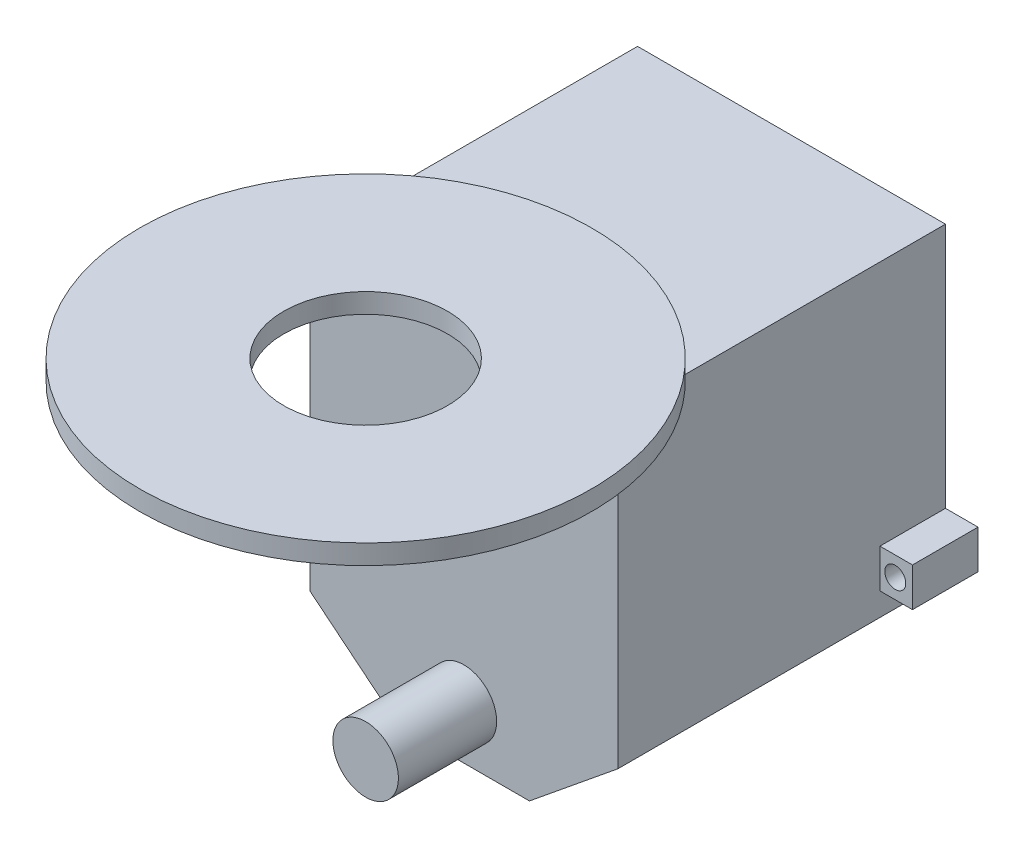
ISO-10303-21;
HEADER;
FILE_DESCRIPTION(('STEP AP214'),'2;1');
FILE_NAME('part.step','',(''),(''),'','','');
FILE_SCHEMA(('AUTOMOTIVE_DESIGN { 1 0 10303 214 1 1 1 1 }'));
ENDSEC;
DATA;
#1=APPLICATION_CONTEXT('core data for automotive mechanical design processes');
#2=APPLICATION_PROTOCOL_DEFINITION('international standard','automotive_design',2000,#1);
#3=PRODUCT_CONTEXT('',#1,'mechanical');
#4=PRODUCT('Part','Part','',(#3));
#5=PRODUCT_RELATED_PRODUCT_CATEGORY('part','',(#4));
#6=PRODUCT_DEFINITION_FORMATION('','',#4);
#7=PRODUCT_DEFINITION_CONTEXT('part definition',#1,'design');
#8=PRODUCT_DEFINITION('design','',#6,#7);
#9=PRODUCT_DEFINITION_SHAPE('','',#8);
#10=(LENGTH_UNIT() NAMED_UNIT(*) SI_UNIT(.MILLI.,.METRE.));
#11=(NAMED_UNIT(*) PLANE_ANGLE_UNIT() SI_UNIT($,.RADIAN.));
#12=(NAMED_UNIT(*) SI_UNIT($,.STERADIAN.) SOLID_ANGLE_UNIT());
#13=UNCERTAINTY_MEASURE_WITH_UNIT(LENGTH_MEASURE(1.E-05),#10,'distance_accuracy_value','');
#14=(GEOMETRIC_REPRESENTATION_CONTEXT(3) GLOBAL_UNCERTAINTY_ASSIGNED_CONTEXT((#13)) GLOBAL_UNIT_ASSIGNED_CONTEXT((#10,
#11,#12)) REPRESENTATION_CONTEXT('',''));
#15=CARTESIAN_POINT('',(0.,0.,0.));
#16=DIRECTION('',(0.,0.,1.));
#17=DIRECTION('',(1.,0.,0.));
#18=AXIS2_PLACEMENT_3D('',#15,#16,#17);
#19=CARTESIAN_POINT('',(-3.25491694199694,-4.5159884679955,10.));
#20=DIRECTION('',(0.,1.,0.));
#21=DIRECTION('',(-1.,0.,0.));
#22=AXIS2_PLACEMENT_3D('',#19,#20,#21);
#23=PLANE('',#22);
#24=DIRECTION('',(1.,0.,0.));
#25=VECTOR('',#24,1.);
#26=CARTESIAN_POINT('',(-3.25491694199694,-4.5159884679955,0.));
#27=LINE('',#26,#25);
#28=CARTESIAN_POINT('',(-3.25491694199694,-4.5159884679955,0.));
#29=VERTEX_POINT('',#28);
#30=CARTESIAN_POINT('',(1.41332373157611,-4.51598846799551,0.));
#31=VERTEX_POINT('',#30);
#32=EDGE_CURVE('E123',#29,#31,#27,.T.);
#33=ORIENTED_EDGE('',*,*,#32,.T.);
#34=DIRECTION('',(0.,0.,-1.));
#35=VECTOR('',#34,1.);
#36=CARTESIAN_POINT('',(1.41332373157611,-4.51598846799551,10.));
#37=LINE('',#36,#35);
#38=CARTESIAN_POINT('',(1.41332373157611,-4.51598846799551,10.));
#39=VERTEX_POINT('',#38);
#40=EDGE_CURVE('E13',#39,#31,#37,.T.);
#41=ORIENTED_EDGE('',*,*,#40,.F.);
#42=DIRECTION('',(1.,0.,0.));
#43=VECTOR('',#42,1.);
#44=CARTESIAN_POINT('',(-3.25491694199694,-4.5159884679955,10.));
#45=LINE('',#44,#43);
#46=CARTESIAN_POINT('',(-3.25491694199694,-4.5159884679955,10.));
#47=VERTEX_POINT('',#46);
#48=EDGE_CURVE('E111',#47,#39,#45,.T.);
#49=ORIENTED_EDGE('',*,*,#48,.F.);
#50=DIRECTION('',(0.,0.,-1.));
#51=VECTOR('',#50,1.);
#52=CARTESIAN_POINT('',(-3.25491694199694,-4.5159884679955,10.));
#53=LINE('',#52,#51);
#54=EDGE_CURVE('E119',#47,#29,#53,.T.);
#55=ORIENTED_EDGE('',*,*,#54,.T.);
#56=EDGE_LOOP('',(#33,#41,#49,#55));
#57=FACE_BOUND('',#56,.T.);
#58=ADVANCED_FACE('F60',(#57),#23,.F.);
#59=CARTESIAN_POINT('',(1.41332373157611,-4.51598846799551,10.));
#60=DIRECTION('',(-1.,0.,0.));
#61=DIRECTION('',(0.,0.,1.));
#62=AXIS2_PLACEMENT_3D('',#59,#60,#61);
#63=PLANE('',#62);
#64=DIRECTION('',(0.,1.,0.));
#65=VECTOR('',#64,1.);
#66=CARTESIAN_POINT('',(1.41332373157611,-4.51598846799551,0.));
#67=LINE('',#66,#65);
#68=CARTESIAN_POINT('',(1.41332373157611,0.,0.));
#69=VERTEX_POINT('',#68);
#70=EDGE_CURVE('E115',#31,#69,#67,.T.);
#71=ORIENTED_EDGE('',*,*,#70,.T.);
#72=DIRECTION('',(0.,0.,-1.));
#73=VECTOR('',#72,1.);
#74=CARTESIAN_POINT('',(1.41332373157611,0.,10.));
#75=LINE('',#74,#73);
#76=CARTESIAN_POINT('',(1.41332373157611,0.,10.));
#77=VERTEX_POINT('',#76);
#78=EDGE_CURVE('E68',#77,#69,#75,.T.);
#79=ORIENTED_EDGE('',*,*,#78,.F.);
#80=DIRECTION('',(0.,1.,0.));
#81=VECTOR('',#80,1.);
#82=CARTESIAN_POINT('',(1.41332373157611,-4.51598846799551,10.));
#83=LINE('',#82,#81);
#84=EDGE_CURVE('E106',#39,#77,#83,.T.);
#85=ORIENTED_EDGE('',*,*,#84,.F.);
#86=ORIENTED_EDGE('',*,*,#40,.T.);
#87=EDGE_LOOP('',(#71,#79,#85,#86));
#88=FACE_BOUND('',#87,.T.);
#89=ADVANCED_FACE('F114',(#88),#63,.F.);
#90=CARTESIAN_POINT('',(1.41332373157611,0.,10.));
#91=DIRECTION('',(0.,-1.,0.));
#92=DIRECTION('',(0.,0.,-1.));
#93=AXIS2_PLACEMENT_3D('',#90,#91,#92);
#94=PLANE('',#93);
#95=DIRECTION('',(-1.,0.,0.));
#96=VECTOR('',#95,1.);
#97=CARTESIAN_POINT('',(1.41332373157611,0.,0.));
#98=LINE('',#97,#96);
#99=CARTESIAN_POINT('',(-3.25491694199694,0.,0.));
#100=VERTEX_POINT('',#99);
#101=EDGE_CURVE('E93',#69,#100,#98,.T.);
#102=ORIENTED_EDGE('',*,*,#101,.T.);
#103=DIRECTION('',(0.,0.,-1.));
#104=VECTOR('',#103,1.);
#105=CARTESIAN_POINT('',(-3.25491694199694,0.,10.));
#106=LINE('',#105,#104);
#107=CARTESIAN_POINT('',(-3.25491694199694,0.,10.));
#108=VERTEX_POINT('',#107);
#109=EDGE_CURVE('E116',#108,#100,#106,.T.);
#110=ORIENTED_EDGE('',*,*,#109,.F.);
#111=DIRECTION('',(-1.,0.,0.));
#112=VECTOR('',#111,1.);
#113=CARTESIAN_POINT('',(1.41332373157611,0.,10.));
#114=LINE('',#113,#112);
#115=EDGE_CURVE('E109',#77,#108,#114,.T.);
#116=ORIENTED_EDGE('',*,*,#115,.F.);
#117=ORIENTED_EDGE('',*,*,#78,.T.);
#118=EDGE_LOOP('',(#102,#110,#116,#117));
#119=FACE_BOUND('',#118,.T.);
#120=ADVANCED_FACE('F117',(#119),#94,.F.);
#121=CARTESIAN_POINT('',(-3.25491694199694,0.,10.));
#122=DIRECTION('',(1.,0.,0.));
#123=DIRECTION('',(0.,1.,0.));
#124=AXIS2_PLACEMENT_3D('',#121,#122,#123);
#125=PLANE('',#124);
#126=DIRECTION('',(0.,-1.,0.));
#127=VECTOR('',#126,1.);
#128=CARTESIAN_POINT('',(-3.25491694199694,0.,0.));
#129=LINE('',#128,#127);
#130=EDGE_CURVE('E99',#100,#29,#129,.T.);
#131=ORIENTED_EDGE('',*,*,#130,.T.);
#132=ORIENTED_EDGE('',*,*,#54,.F.);
#133=DIRECTION('',(0.,-1.,0.));
#134=VECTOR('',#133,1.);
#135=CARTESIAN_POINT('',(-3.25491694199694,0.,10.));
#136=LINE('',#135,#134);
#137=EDGE_CURVE('E76',#108,#47,#136,.T.);
#138=ORIENTED_EDGE('',*,*,#137,.F.);
#139=ORIENTED_EDGE('',*,*,#109,.T.);
#140=EDGE_LOOP('',(#131,#132,#138,#139));
#141=FACE_BOUND('',#140,.T.);
#142=ADVANCED_FACE('F131',(#141),#125,.F.);
#143=CARTESIAN_POINT('',(0.,0.,10.));
#144=DIRECTION('',(0.,0.,1.));
#145=DIRECTION('',(1.,0.,0.));
#146=AXIS2_PLACEMENT_3D('',#143,#144,#145);
#147=PLANE('',#146);
#148=CARTESIAN_POINT('',(-1.16129211516998,-2.32651944105953,10.));
#149=DIRECTION('',(0.,0.,-1.));
#150=DIRECTION('',(-1.,0.,0.));
#151=AXIS2_PLACEMENT_3D('',#148,#149,#150);
#152=CIRCLE('',#151,1.6);
#153=CARTESIAN_POINT('',(-2.76129211516998,-2.32651944105953,10.));
#154=VERTEX_POINT('',#153);
#155=EDGE_CURVE('E126',#154,#154,#152,.T.);
#156=ORIENTED_EDGE('',*,*,#155,.T.);
#157=EDGE_LOOP('',(#156));
#158=FACE_BOUND('',#157,.T.);
#159=ORIENTED_EDGE('',*,*,#48,.T.);
#160=ORIENTED_EDGE('',*,*,#84,.T.);
#161=ORIENTED_EDGE('',*,*,#115,.T.);
#162=ORIENTED_EDGE('',*,*,#137,.T.);
#163=EDGE_LOOP('',(#159,#160,#161,#162));
#164=FACE_BOUND('',#163,.T.);
#165=ADVANCED_FACE('F107',(#158,#164),#147,.T.);
#166=CARTESIAN_POINT('',(0.,0.,0.));
#167=DIRECTION('',(0.,0.,1.));
#168=DIRECTION('',(1.,0.,0.));
#169=AXIS2_PLACEMENT_3D('',#166,#167,#168);
#170=PLANE('',#169);
#171=CARTESIAN_POINT('',(-1.16129211516998,-2.32651944105953,0.));
#172=DIRECTION('',(0.,0.,-1.));
#173=DIRECTION('',(-1.,0.,0.));
#174=AXIS2_PLACEMENT_3D('',#171,#172,#173);
#175=CIRCLE('',#174,1.6);
#176=CARTESIAN_POINT('',(-2.76129211516998,-2.32651944105953,0.));
#177=VERTEX_POINT('',#176);
#178=EDGE_CURVE('E137',#177,#177,#175,.T.);
#179=ORIENTED_EDGE('',*,*,#178,.F.);
#180=EDGE_LOOP('',(#179));
#181=FACE_BOUND('',#180,.T.);
#182=ORIENTED_EDGE('',*,*,#32,.F.);
#183=ORIENTED_EDGE('',*,*,#130,.F.);
#184=ORIENTED_EDGE('',*,*,#101,.F.);
#185=ORIENTED_EDGE('',*,*,#70,.F.);
#186=EDGE_LOOP('',(#182,#183,#184,#185));
#187=FACE_BOUND('',#186,.T.);
#188=ADVANCED_FACE('F134',(#181,#187),#170,.F.);
#189=CARTESIAN_POINT('',(-1.16129211516998,-2.32651944105953,10.));
#190=DIRECTION('',(0.,0.,-1.));
#191=DIRECTION('',(-1.,0.,0.));
#192=AXIS2_PLACEMENT_3D('',#189,#190,#191);
#193=CYLINDRICAL_SURFACE('',#192,1.6);
#194=ORIENTED_EDGE('',*,*,#155,.F.);
#195=EDGE_LOOP('',(#194));
#196=FACE_BOUND('',#195,.T.);
#197=ORIENTED_EDGE('',*,*,#178,.T.);
#198=EDGE_LOOP('',(#197));
#199=FACE_BOUND('',#198,.T.);
#200=ADVANCED_FACE('F144',(#196,#199),#193,.F.);
#201=CLOSED_SHELL('',(#58,#89,#120,#142,#165,#188,#200));
#202=MANIFOLD_SOLID_BREP('B2',#201);
#203=CARTESIAN_POINT('',(-23.5,11.,50.));
#204=DIRECTION('',(1.,0.,0.));
#205=DIRECTION('',(0.,0.,-1.));
#206=AXIS2_PLACEMENT_3D('',#203,#204,#205);
#207=PLANE('',#206);
#208=DIRECTION('',(0.,0.,-1.));
#209=VECTOR('',#208,1.);
#210=CARTESIAN_POINT('',(-23.5,20.4345973168426,10.));
#211=LINE('',#210,#209);
#212=CARTESIAN_POINT('',(-23.5,20.4345973168426,10.));
#213=VERTEX_POINT('',#212);
#214=CARTESIAN_POINT('',(-23.5,20.4345973168426,0.));
#215=VERTEX_POINT('',#214);
#216=EDGE_CURVE('E408',#213,#215,#211,.T.);
#217=ORIENTED_EDGE('',*,*,#216,.F.);
#218=DIRECTION('',(0.,1.,0.));
#219=VECTOR('',#218,1.);
#220=CARTESIAN_POINT('',(-23.5,14.5178015456926,10.));
#221=LINE('',#220,#219);
#222=CARTESIAN_POINT('',(-23.5,14.5178015456926,10.));
#223=VERTEX_POINT('',#222);
#224=EDGE_CURVE('E393',#223,#213,#221,.T.);
#225=ORIENTED_EDGE('',*,*,#224,.F.);
#226=DIRECTION('',(0.,0.,-1.));
#227=VECTOR('',#226,1.);
#228=CARTESIAN_POINT('',(-23.5,14.5178015456926,10.));
#229=LINE('',#228,#227);
#230=CARTESIAN_POINT('',(-23.5,14.5178015456926,0.));
#231=VERTEX_POINT('',#230);
#232=EDGE_CURVE('E403',#223,#231,#229,.T.);
#233=ORIENTED_EDGE('',*,*,#232,.T.);
#234=DIRECTION('',(0.,-1.,0.));
#235=VECTOR('',#234,1.);
#236=CARTESIAN_POINT('',(-23.5,11.,0.));
#237=LINE('',#236,#235);
#238=CARTESIAN_POINT('',(-23.5,11.,0.));
#239=VERTEX_POINT('',#238);
#240=EDGE_CURVE('E520',#231,#239,#237,.T.);
#241=ORIENTED_EDGE('',*,*,#240,.T.);
#242=DIRECTION('',(0.,0.,-1.));
#243=VECTOR('',#242,1.);
#244=CARTESIAN_POINT('',(-23.5,11.,50.));
#245=LINE('',#244,#243);
#246=CARTESIAN_POINT('',(-23.5,11.,50.));
#247=VERTEX_POINT('',#246);
#248=EDGE_CURVE('E368',#247,#239,#245,.T.);
#249=ORIENTED_EDGE('',*,*,#248,.F.);
#250=DIRECTION('',(0.,-1.,0.));
#251=VECTOR('',#250,1.);
#252=CARTESIAN_POINT('',(-23.5,11.,50.));
#253=LINE('',#252,#251);
#254=CARTESIAN_POINT('',(-23.5,58.,50.));
#255=VERTEX_POINT('',#254);
#256=EDGE_CURVE('E358',#255,#247,#253,.T.);
#257=ORIENTED_EDGE('',*,*,#256,.F.);
#258=DIRECTION('',(0.,0.,-1.));
#259=VECTOR('',#258,1.);
#260=CARTESIAN_POINT('',(-23.5,58.,50.));
#261=LINE('',#260,#259);
#262=CARTESIAN_POINT('',(-23.5,58.,39.7413381193698));
#263=VERTEX_POINT('',#262);
#264=EDGE_CURVE('E352',#255,#263,#261,.T.);
#265=ORIENTED_EDGE('',*,*,#264,.T.);
#266=CARTESIAN_POINT('',(-23.5,58.,0.));
#267=VERTEX_POINT('',#266);
#268=EDGE_CURVE('E355',#263,#267,#261,.T.);
#269=ORIENTED_EDGE('',*,*,#268,.T.);
#270=EDGE_CURVE('E500',#267,#215,#237,.T.);
#271=ORIENTED_EDGE('',*,*,#270,.T.);
#272=EDGE_LOOP('',(#217,#225,#233,#241,#249,#257,#265,#269,#271));
#273=FACE_BOUND('',#272,.T.);
#274=ADVANCED_FACE('F206',(#273),#207,.F.);
#275=CARTESIAN_POINT('',(23.5,11.,50.));
#276=DIRECTION('',(-1.,0.,0.));
#277=DIRECTION('',(0.,-1.,0.));
#278=AXIS2_PLACEMENT_3D('',#275,#276,#277);
#279=PLANE('',#278);
#280=DIRECTION('',(0.,0.,-1.));
#281=VECTOR('',#280,1.);
#282=CARTESIAN_POINT('',(23.5,14.5178015456926,10.));
#283=LINE('',#282,#281);
#284=CARTESIAN_POINT('',(23.5,14.5178015456926,10.));
#285=VERTEX_POINT('',#284);
#286=CARTESIAN_POINT('',(23.5,14.5178015456926,0.));
#287=VERTEX_POINT('',#286);
#288=EDGE_CURVE('E445',#285,#287,#283,.T.);
#289=ORIENTED_EDGE('',*,*,#288,.F.);
#290=DIRECTION('',(0.,1.,0.));
#291=VECTOR('',#290,1.);
#292=CARTESIAN_POINT('',(23.5,14.5178015456926,10.));
#293=LINE('',#292,#291);
#294=CARTESIAN_POINT('',(23.5,20.4345973168426,10.));
#295=VERTEX_POINT('',#294);
#296=EDGE_CURVE('E424',#285,#295,#293,.T.);
#297=ORIENTED_EDGE('',*,*,#296,.T.);
#298=DIRECTION('',(0.,0.,-1.));
#299=VECTOR('',#298,1.);
#300=CARTESIAN_POINT('',(23.5,20.4345973168426,10.));
#301=LINE('',#300,#299);
#302=CARTESIAN_POINT('',(23.5,20.4345973168426,0.));
#303=VERTEX_POINT('',#302);
#304=EDGE_CURVE('E437',#295,#303,#301,.T.);
#305=ORIENTED_EDGE('',*,*,#304,.T.);
#306=DIRECTION('',(0.,1.,0.));
#307=VECTOR('',#306,1.);
#308=CARTESIAN_POINT('',(23.5,11.,0.));
#309=LINE('',#308,#307);
#310=CARTESIAN_POINT('',(23.5,58.,0.));
#311=VERTEX_POINT('',#310);
#312=EDGE_CURVE('E515',#303,#311,#309,.T.);
#313=ORIENTED_EDGE('',*,*,#312,.T.);
#314=DIRECTION('',(0.,0.,-1.));
#315=VECTOR('',#314,1.);
#316=CARTESIAN_POINT('',(23.5,58.,50.));
#317=LINE('',#316,#315);
#318=CARTESIAN_POINT('',(23.5,58.,39.7413381193698));
#319=VERTEX_POINT('',#318);
#320=EDGE_CURVE('E362',#319,#311,#317,.T.);
#321=ORIENTED_EDGE('',*,*,#320,.F.);
#322=CARTESIAN_POINT('',(23.5,58.,50.));
#323=VERTEX_POINT('',#322);
#324=EDGE_CURVE('E374',#323,#319,#317,.T.);
#325=ORIENTED_EDGE('',*,*,#324,.F.);
#326=DIRECTION('',(0.,1.,0.));
#327=VECTOR('',#326,1.);
#328=CARTESIAN_POINT('',(23.5,11.,50.));
#329=LINE('',#328,#327);
#330=CARTESIAN_POINT('',(23.5,11.,50.));
#331=VERTEX_POINT('',#330);
#332=EDGE_CURVE('E504',#331,#323,#329,.T.);
#333=ORIENTED_EDGE('',*,*,#332,.F.);
#334=DIRECTION('',(0.,0.,-1.));
#335=VECTOR('',#334,1.);
#336=CARTESIAN_POINT('',(23.5,11.,50.));
#337=LINE('',#336,#335);
#338=CARTESIAN_POINT('',(23.5,11.,0.));
#339=VERTEX_POINT('',#338);
#340=EDGE_CURVE('E525',#331,#339,#337,.T.);
#341=ORIENTED_EDGE('',*,*,#340,.T.);
#342=EDGE_CURVE('E516',#339,#287,#309,.T.);
#343=ORIENTED_EDGE('',*,*,#342,.T.);
#344=EDGE_LOOP('',(#289,#297,#305,#313,#321,#325,#333,#341,#343));
#345=FACE_BOUND('',#344,.T.);
#346=ADVANCED_FACE('F551',(#345),#279,.F.);
#347=CARTESIAN_POINT('',(-9.99999999999999,0.,50.));
#348=DIRECTION('',(0.631672951162236,0.77523498551729,0.));
#349=DIRECTION('',(-0.775234985517289,0.631672951162235,0.));
#350=AXIS2_PLACEMENT_3D('',#347,#348,#349);
#351=PLANE('',#350);
#352=DIRECTION('',(0.77523498551729,-0.631672951162236,0.));
#353=VECTOR('',#352,1.);
#354=CARTESIAN_POINT('',(-9.99999999999999,0.,0.));
#355=LINE('',#354,#353);
#356=CARTESIAN_POINT('',(-9.99999999999999,0.,0.));
#357=VERTEX_POINT('',#356);
#358=EDGE_CURVE('E495',#239,#357,#355,.T.);
#359=ORIENTED_EDGE('',*,*,#358,.T.);
#360=DIRECTION('',(0.,0.,-1.));
#361=VECTOR('',#360,1.);
#362=CARTESIAN_POINT('',(-9.99999999999999,0.,50.));
#363=LINE('',#362,#361);
#364=CARTESIAN_POINT('',(-9.99999999999999,0.,50.));
#365=VERTEX_POINT('',#364);
#366=EDGE_CURVE('E214',#365,#357,#363,.T.);
#367=ORIENTED_EDGE('',*,*,#366,.F.);
#368=DIRECTION('',(0.77523498551729,-0.631672951162236,0.));
#369=VECTOR('',#368,1.);
#370=CARTESIAN_POINT('',(-9.99999999999999,0.,50.));
#371=LINE('',#370,#369);
#372=EDGE_CURVE('E496',#247,#365,#371,.T.);
#373=ORIENTED_EDGE('',*,*,#372,.F.);
#374=ORIENTED_EDGE('',*,*,#248,.T.);
#375=EDGE_LOOP('',(#359,#367,#373,#374));
#376=FACE_BOUND('',#375,.T.);
#377=ADVANCED_FACE('F208',(#376),#351,.F.);
#378=CARTESIAN_POINT('',(10.,0.,50.));
#379=DIRECTION('',(0.,1.,0.));
#380=DIRECTION('',(-1.,0.,0.));
#381=AXIS2_PLACEMENT_3D('',#378,#379,#380);
#382=PLANE('',#381);
#383=DIRECTION('',(1.,0.,0.));
#384=VECTOR('',#383,1.);
#385=CARTESIAN_POINT('',(10.,0.,0.));
#386=LINE('',#385,#384);
#387=CARTESIAN_POINT('',(10.,0.,0.));
#388=VERTEX_POINT('',#387);
#389=EDGE_CURVE('E511',#357,#388,#386,.T.);
#390=ORIENTED_EDGE('',*,*,#389,.T.);
#391=DIRECTION('',(0.,0.,-1.));
#392=VECTOR('',#391,1.);
#393=CARTESIAN_POINT('',(10.,0.,50.));
#394=LINE('',#393,#392);
#395=CARTESIAN_POINT('',(10.,0.,50.));
#396=VERTEX_POINT('',#395);
#397=EDGE_CURVE('E528',#396,#388,#394,.T.);
#398=ORIENTED_EDGE('',*,*,#397,.F.);
#399=DIRECTION('',(1.,0.,0.));
#400=VECTOR('',#399,1.);
#401=CARTESIAN_POINT('',(10.,0.,50.));
#402=LINE('',#401,#400);
#403=EDGE_CURVE('E499',#365,#396,#402,.T.);
#404=ORIENTED_EDGE('',*,*,#403,.F.);
#405=ORIENTED_EDGE('',*,*,#366,.T.);
#406=EDGE_LOOP('',(#390,#398,#404,#405));
#407=FACE_BOUND('',#406,.T.);
#408=ADVANCED_FACE('F533',(#407),#382,.F.);
#409=CARTESIAN_POINT('',(10.,0.,50.));
#410=DIRECTION('',(-0.631672951162236,0.775234985517289,0.));
#411=DIRECTION('',(-0.775234985517289,-0.631672951162236,0.));
#412=AXIS2_PLACEMENT_3D('',#409,#410,#411);
#413=PLANE('',#412);
#414=DIRECTION('',(0.775234985517289,0.631672951162236,0.));
#415=VECTOR('',#414,1.);
#416=CARTESIAN_POINT('',(10.,0.,0.));
#417=LINE('',#416,#415);
#418=EDGE_CURVE('E513',#388,#339,#417,.T.);
#419=ORIENTED_EDGE('',*,*,#418,.T.);
#420=ORIENTED_EDGE('',*,*,#340,.F.);
#421=DIRECTION('',(0.775234985517289,0.631672951162236,0.));
#422=VECTOR('',#421,1.);
#423=CARTESIAN_POINT('',(10.,0.,50.));
#424=LINE('',#423,#422);
#425=EDGE_CURVE('E502',#396,#331,#424,.T.);
#426=ORIENTED_EDGE('',*,*,#425,.F.);
#427=ORIENTED_EDGE('',*,*,#397,.T.);
#428=EDGE_LOOP('',(#419,#420,#426,#427));
#429=FACE_BOUND('',#428,.T.);
#430=ADVANCED_FACE('F546',(#429),#413,.F.);
#431=CARTESIAN_POINT('',(-23.5,58.,50.));
#432=DIRECTION('',(0.,-1.,0.));
#433=DIRECTION('',(1.,0.,0.));
#434=AXIS2_PLACEMENT_3D('',#431,#432,#433);
#435=PLANE('',#434);
#436=CARTESIAN_POINT('',(0.,58.,65.));
#437=DIRECTION('',(0.,1.,0.));
#438=DIRECTION('',(-1.,0.,0.));
#439=AXIS2_PLACEMENT_3D('',#436,#437,#438);
#440=CIRCLE('',#439,34.5);
#441=EDGE_CURVE('E221',#319,#263,#440,.T.);
#442=ORIENTED_EDGE('',*,*,#441,.F.);
#443=ORIENTED_EDGE('',*,*,#320,.T.);
#444=DIRECTION('',(-1.,0.,0.));
#445=VECTOR('',#444,1.);
#446=CARTESIAN_POINT('',(-23.5,58.,0.));
#447=LINE('',#446,#445);
#448=EDGE_CURVE('E366',#311,#267,#447,.T.);
#449=ORIENTED_EDGE('',*,*,#448,.T.);
#450=ORIENTED_EDGE('',*,*,#268,.F.);
#451=EDGE_LOOP('',(#442,#443,#449,#450));
#452=FACE_BOUND('',#451,.T.);
#453=ADVANCED_FACE('F364',(#452),#435,.F.);
#454=CARTESIAN_POINT('',(0.,0.,50.));
#455=DIRECTION('',(0.,0.,-1.));
#456=DIRECTION('',(-1.,0.,0.));
#457=AXIS2_PLACEMENT_3D('',#454,#455,#456);
#458=PLANE('',#457);
#459=CARTESIAN_POINT('',(0.,8.,50.));
#460=DIRECTION('',(0.,0.,-1.));
#461=DIRECTION('',(-1.,0.,0.));
#462=AXIS2_PLACEMENT_3D('',#459,#460,#461);
#463=CIRCLE('',#462,5.);
#464=CARTESIAN_POINT('',(-5.,8.,50.));
#465=VERTEX_POINT('',#464);
#466=EDGE_CURVE('E58',#465,#465,#463,.F.);
#467=ORIENTED_EDGE('',*,*,#466,.F.);
#468=EDGE_LOOP('',(#467));
#469=FACE_BOUND('',#468,.T.);
#470=ORIENTED_EDGE('',*,*,#372,.T.);
#471=ORIENTED_EDGE('',*,*,#403,.T.);
#472=ORIENTED_EDGE('',*,*,#425,.T.);
#473=ORIENTED_EDGE('',*,*,#332,.T.);
#474=DIRECTION('',(-1.,0.,0.));
#475=VECTOR('',#474,1.);
#476=CARTESIAN_POINT('',(-23.5,58.,50.));
#477=LINE('',#476,#475);
#478=EDGE_CURVE('E506',#323,#255,#477,.T.);
#479=ORIENTED_EDGE('',*,*,#478,.T.);
#480=ORIENTED_EDGE('',*,*,#256,.T.);
#481=EDGE_LOOP('',(#470,#471,#472,#473,#479,#480));
#482=FACE_BOUND('',#481,.T.);
#483=ADVANCED_FACE('F553',(#469,#482),#458,.F.);
#484=CARTESIAN_POINT('',(0.,0.,0.));
#485=DIRECTION('',(0.,0.,-1.));
#486=DIRECTION('',(-1.,0.,0.));
#487=AXIS2_PLACEMENT_3D('',#484,#485,#486);
#488=PLANE('',#487);
#489=DIRECTION('',(-1.,0.,0.));
#490=VECTOR('',#489,1.);
#491=CARTESIAN_POINT('',(9.28835004231492,2.,0.));
#492=LINE('',#491,#490);
#493=CARTESIAN_POINT('',(9.28835004231492,2.,0.));
#494=VERTEX_POINT('',#493);
#495=CARTESIAN_POINT('',(-9.2883500423149,2.,0.));
#496=VERTEX_POINT('',#495);
#497=EDGE_CURVE('E447',#494,#496,#492,.T.);
#498=ORIENTED_EDGE('',*,*,#497,.F.);
#499=DIRECTION('',(-0.775234985517289,-0.631672951162236,0.));
#500=VECTOR('',#499,1.);
#501=CARTESIAN_POINT('',(21.5,11.9502332988545,0.));
#502=LINE('',#501,#500);
#503=CARTESIAN_POINT('',(21.5,11.9502332988545,0.));
#504=VERTEX_POINT('',#503);
#505=EDGE_CURVE('E479',#504,#494,#502,.T.);
#506=ORIENTED_EDGE('',*,*,#505,.F.);
#507=DIRECTION('',(0.,-1.,0.));
#508=VECTOR('',#507,1.);
#509=CARTESIAN_POINT('',(21.5,56.,0.));
#510=LINE('',#509,#508);
#511=CARTESIAN_POINT('',(21.5,56.,0.));
#512=VERTEX_POINT('',#511);
#513=EDGE_CURVE('E476',#512,#504,#510,.T.);
#514=ORIENTED_EDGE('',*,*,#513,.F.);
#515=DIRECTION('',(1.,0.,0.));
#516=VECTOR('',#515,1.);
#517=CARTESIAN_POINT('',(-21.5,56.,0.));
#518=LINE('',#517,#516);
#519=CARTESIAN_POINT('',(-21.5,56.,0.));
#520=VERTEX_POINT('',#519);
#521=EDGE_CURVE('E473',#520,#512,#518,.T.);
#522=ORIENTED_EDGE('',*,*,#521,.F.);
#523=DIRECTION('',(0.,1.,0.));
#524=VECTOR('',#523,1.);
#525=CARTESIAN_POINT('',(-21.5,11.9502332988545,0.));
#526=LINE('',#525,#524);
#527=CARTESIAN_POINT('',(-21.5,11.9502332988545,0.));
#528=VERTEX_POINT('',#527);
#529=EDGE_CURVE('E470',#528,#520,#526,.T.);
#530=ORIENTED_EDGE('',*,*,#529,.F.);
#531=DIRECTION('',(-0.77523498551729,0.631672951162236,0.));
#532=VECTOR('',#531,1.);
#533=CARTESIAN_POINT('',(-9.2883500423149,2.,0.));
#534=LINE('',#533,#532);
#535=EDGE_CURVE('E467',#496,#528,#534,.T.);
#536=ORIENTED_EDGE('',*,*,#535,.F.);
#537=EDGE_LOOP('',(#498,#506,#514,#522,#530,#536));
#538=FACE_BOUND('',#537,.T.);
#539=ORIENTED_EDGE('',*,*,#358,.F.);
#540=ORIENTED_EDGE('',*,*,#240,.F.);
#541=DIRECTION('',(1.,0.,0.));
#542=VECTOR('',#541,1.);
#543=CARTESIAN_POINT('',(-28.4663618767547,14.5178015456926,0.));
#544=LINE('',#543,#542);
#545=CARTESIAN_POINT('',(-28.4663618767547,14.5178015456926,0.));
#546=VERTEX_POINT('',#545);
#547=EDGE_CURVE('E229',#546,#231,#544,.T.);
#548=ORIENTED_EDGE('',*,*,#547,.F.);
#549=DIRECTION('',(0.,-1.,0.));
#550=VECTOR('',#549,1.);
#551=CARTESIAN_POINT('',(-28.4663618767547,20.4345973168426,0.));
#552=LINE('',#551,#550);
#553=CARTESIAN_POINT('',(-28.4663618767547,20.4345973168426,0.));
#554=VERTEX_POINT('',#553);
#555=EDGE_CURVE('E405',#554,#546,#552,.T.);
#556=ORIENTED_EDGE('',*,*,#555,.F.);
#557=DIRECTION('',(-1.,0.,0.));
#558=VECTOR('',#557,1.);
#559=CARTESIAN_POINT('',(-23.5,20.4345973168426,0.));
#560=LINE('',#559,#558);
#561=EDGE_CURVE('E397',#215,#554,#560,.T.);
#562=ORIENTED_EDGE('',*,*,#561,.F.);
#563=ORIENTED_EDGE('',*,*,#270,.F.);
#564=ORIENTED_EDGE('',*,*,#448,.F.);
#565=ORIENTED_EDGE('',*,*,#312,.F.);
#566=DIRECTION('',(1.,0.,0.));
#567=VECTOR('',#566,1.);
#568=CARTESIAN_POINT('',(23.5,20.4345973168426,0.));
#569=LINE('',#568,#567);
#570=CARTESIAN_POINT('',(28.4663618767547,20.4345973168426,0.));
#571=VERTEX_POINT('',#570);
#572=EDGE_CURVE('E421',#303,#571,#569,.T.);
#573=ORIENTED_EDGE('',*,*,#572,.T.);
#574=DIRECTION('',(0.,-1.,0.));
#575=VECTOR('',#574,1.);
#576=CARTESIAN_POINT('',(28.4663618767547,20.4345973168426,0.));
#577=LINE('',#576,#575);
#578=CARTESIAN_POINT('',(28.4663618767547,14.5178015456926,0.));
#579=VERTEX_POINT('',#578);
#580=EDGE_CURVE('E440',#571,#579,#577,.T.);
#581=ORIENTED_EDGE('',*,*,#580,.T.);
#582=DIRECTION('',(-1.,0.,0.));
#583=VECTOR('',#582,1.);
#584=CARTESIAN_POINT('',(28.4663618767547,14.5178015456926,0.));
#585=LINE('',#584,#583);
#586=EDGE_CURVE('E428',#579,#287,#585,.T.);
#587=ORIENTED_EDGE('',*,*,#586,.T.);
#588=ORIENTED_EDGE('',*,*,#342,.F.);
#589=ORIENTED_EDGE('',*,*,#418,.F.);
#590=ORIENTED_EDGE('',*,*,#389,.F.);
#591=EDGE_LOOP('',(#539,#540,#548,#556,#562,#563,#564,#565,#573,#581,#587,#588,#589,#590));
#592=FACE_BOUND('',#591,.T.);
#593=CARTESIAN_POINT('',(25.8366748673547,17.4761994312676,0.));
#594=DIRECTION('',(0.,0.,-1.));
#595=DIRECTION('',(-1.,0.,0.));
#596=AXIS2_PLACEMENT_3D('',#593,#594,#595);
#597=CIRCLE('',#596,1.6);
#598=CARTESIAN_POINT('',(24.2366748673547,17.4761994312676,0.));
#599=VERTEX_POINT('',#598);
#600=EDGE_CURVE('E411',#599,#599,#597,.T.);
#601=ORIENTED_EDGE('',*,*,#600,.F.);
#602=EDGE_LOOP('',(#601));
#603=FACE_BOUND('',#602,.T.);
#604=CARTESIAN_POINT('',(-25.8366748673547,17.4761994312676,0.));
#605=DIRECTION('',(0.,0.,1.));
#606=DIRECTION('',(1.,0.,0.));
#607=AXIS2_PLACEMENT_3D('',#604,#605,#606);
#608=CIRCLE('',#607,1.6);
#609=CARTESIAN_POINT('',(-24.2366748673547,17.4761994312676,0.));
#610=VERTEX_POINT('',#609);
#611=EDGE_CURVE('E387',#610,#610,#608,.T.);
#612=ORIENTED_EDGE('',*,*,#611,.T.);
#613=EDGE_LOOP('',(#612));
#614=FACE_BOUND('',#613,.T.);
#615=ADVANCED_FACE('F540',(#538,#592,#603,#614),#488,.T.);
#616=CARTESIAN_POINT('',(9.28835004231492,2.,119.028979421689));
#617=DIRECTION('',(0.,-1.,0.));
#618=DIRECTION('',(1.,0.,0.));
#619=AXIS2_PLACEMENT_3D('',#616,#617,#618);
#620=PLANE('',#619);
#621=DIRECTION('',(1.,0.,0.));
#622=VECTOR('',#621,1.);
#623=CARTESIAN_POINT('',(9.28835004231492,2.,48.));
#624=LINE('',#623,#622);
#625=CARTESIAN_POINT('',(-9.2883500423149,2.,48.));
#626=VERTEX_POINT('',#625);
#627=CARTESIAN_POINT('',(9.28835004231492,2.,48.));
#628=VERTEX_POINT('',#627);
#629=EDGE_CURVE('E463',#626,#628,#624,.T.);
#630=ORIENTED_EDGE('',*,*,#629,.T.);
#631=DIRECTION('',(0.,0.,-1.));
#632=VECTOR('',#631,1.);
#633=CARTESIAN_POINT('',(9.28835004231492,2.,119.028979421689));
#634=LINE('',#633,#632);
#635=EDGE_CURVE('E457',#628,#494,#634,.T.);
#636=ORIENTED_EDGE('',*,*,#635,.T.);
#637=ORIENTED_EDGE('',*,*,#497,.T.);
#638=DIRECTION('',(0.,0.,-1.));
#639=VECTOR('',#638,1.);
#640=CARTESIAN_POINT('',(-9.2883500423149,2.,119.028979421689));
#641=LINE('',#640,#639);
#642=EDGE_CURVE('E482',#626,#496,#641,.T.);
#643=ORIENTED_EDGE('',*,*,#642,.F.);
#644=EDGE_LOOP('',(#630,#636,#637,#643));
#645=FACE_BOUND('',#644,.T.);
#646=ADVANCED_FACE('F613',(#645),#620,.F.);
#647=CARTESIAN_POINT('',(21.5,11.9502332988545,119.028979421689));
#648=DIRECTION('',(0.631672951162236,-0.775234985517289,0.));
#649=DIRECTION('',(0.775234985517289,0.631672951162236,0.));
#650=AXIS2_PLACEMENT_3D('',#647,#648,#649);
#651=PLANE('',#650);
#652=DIRECTION('',(0.775234985517289,0.631672951162236,0.));
#653=VECTOR('',#652,1.);
#654=CARTESIAN_POINT('',(21.5,11.9502332988545,48.));
#655=LINE('',#654,#653);
#656=CARTESIAN_POINT('',(21.5,11.9502332988545,48.));
#657=VERTEX_POINT('',#656);
#658=EDGE_CURVE('E461',#628,#657,#655,.T.);
#659=ORIENTED_EDGE('',*,*,#658,.T.);
#660=DIRECTION('',(0.,0.,-1.));
#661=VECTOR('',#660,1.);
#662=CARTESIAN_POINT('',(21.5,11.9502332988545,119.028979421689));
#663=LINE('',#662,#661);
#664=EDGE_CURVE('E484',#657,#504,#663,.T.);
#665=ORIENTED_EDGE('',*,*,#664,.T.);
#666=ORIENTED_EDGE('',*,*,#505,.T.);
#667=ORIENTED_EDGE('',*,*,#635,.F.);
#668=EDGE_LOOP('',(#659,#665,#666,#667));
#669=FACE_BOUND('',#668,.T.);
#670=ADVANCED_FACE('F618',(#669),#651,.F.);
#671=CARTESIAN_POINT('',(21.5,56.,119.028979421689));
#672=DIRECTION('',(1.,0.,0.));
#673=DIRECTION('',(0.,1.,0.));
#674=AXIS2_PLACEMENT_3D('',#671,#672,#673);
#675=PLANE('',#674);
#676=DIRECTION('',(0.,1.,0.));
#677=VECTOR('',#676,1.);
#678=CARTESIAN_POINT('',(21.5,56.,48.));
#679=LINE('',#678,#677);
#680=CARTESIAN_POINT('',(21.5,56.,48.));
#681=VERTEX_POINT('',#680);
#682=EDGE_CURVE('E459',#657,#681,#679,.T.);
#683=ORIENTED_EDGE('',*,*,#682,.T.);
#684=DIRECTION('',(0.,0.,-1.));
#685=VECTOR('',#684,1.);
#686=CARTESIAN_POINT('',(21.5,56.,119.028979421689));
#687=LINE('',#686,#685);
#688=EDGE_CURVE('E486',#681,#512,#687,.T.);
#689=ORIENTED_EDGE('',*,*,#688,.T.);
#690=ORIENTED_EDGE('',*,*,#513,.T.);
#691=ORIENTED_EDGE('',*,*,#664,.F.);
#692=EDGE_LOOP('',(#683,#689,#690,#691));
#693=FACE_BOUND('',#692,.T.);
#694=ADVANCED_FACE('F630',(#693),#675,.F.);
#695=CARTESIAN_POINT('',(-21.5,56.,119.028979421689));
#696=DIRECTION('',(0.,1.,0.));
#697=DIRECTION('',(-1.,0.,0.));
#698=AXIS2_PLACEMENT_3D('',#695,#696,#697);
#699=PLANE('',#698);
#700=DIRECTION('',(-1.,0.,0.));
#701=VECTOR('',#700,1.);
#702=CARTESIAN_POINT('',(-21.5,56.,48.));
#703=LINE('',#702,#701);
#704=CARTESIAN_POINT('',(-21.5,56.,48.));
#705=VERTEX_POINT('',#704);
#706=EDGE_CURVE('E456',#681,#705,#703,.T.);
#707=ORIENTED_EDGE('',*,*,#706,.T.);
#708=DIRECTION('',(0.,0.,-1.));
#709=VECTOR('',#708,1.);
#710=CARTESIAN_POINT('',(-21.5,56.,119.028979421689));
#711=LINE('',#710,#709);
#712=EDGE_CURVE('E488',#705,#520,#711,.T.);
#713=ORIENTED_EDGE('',*,*,#712,.T.);
#714=ORIENTED_EDGE('',*,*,#521,.T.);
#715=ORIENTED_EDGE('',*,*,#688,.F.);
#716=EDGE_LOOP('',(#707,#713,#714,#715));
#717=FACE_BOUND('',#716,.T.);
#718=ADVANCED_FACE('F640',(#717),#699,.F.);
#719=CARTESIAN_POINT('',(-21.5,11.9502332988545,119.028979421689));
#720=DIRECTION('',(-1.,0.,0.));
#721=DIRECTION('',(0.,0.,1.));
#722=AXIS2_PLACEMENT_3D('',#719,#720,#721);
#723=PLANE('',#722);
#724=DIRECTION('',(0.,-1.,0.));
#725=VECTOR('',#724,1.);
#726=CARTESIAN_POINT('',(-21.5,11.9502332988545,48.));
#727=LINE('',#726,#725);
#728=CARTESIAN_POINT('',(-21.5,11.9502332988545,48.));
#729=VERTEX_POINT('',#728);
#730=EDGE_CURVE('E454',#705,#729,#727,.T.);
#731=ORIENTED_EDGE('',*,*,#730,.T.);
#732=DIRECTION('',(0.,0.,-1.));
#733=VECTOR('',#732,1.);
#734=CARTESIAN_POINT('',(-21.5,11.9502332988545,119.028979421689));
#735=LINE('',#734,#733);
#736=EDGE_CURVE('E490',#729,#528,#735,.T.);
#737=ORIENTED_EDGE('',*,*,#736,.T.);
#738=ORIENTED_EDGE('',*,*,#529,.T.);
#739=ORIENTED_EDGE('',*,*,#712,.F.);
#740=EDGE_LOOP('',(#731,#737,#738,#739));
#741=FACE_BOUND('',#740,.T.);
#742=ADVANCED_FACE('F650',(#741),#723,.F.);
#743=CARTESIAN_POINT('',(-9.2883500423149,2.,119.028979421689));
#744=DIRECTION('',(-0.631672951162235,-0.775234985517289,0.));
#745=DIRECTION('',(0.77523498551729,-0.631672951162236,0.));
#746=AXIS2_PLACEMENT_3D('',#743,#744,#745);
#747=PLANE('',#746);
#748=DIRECTION('',(0.77523498551729,-0.631672951162236,0.));
#749=VECTOR('',#748,1.);
#750=CARTESIAN_POINT('',(-9.2883500423149,2.,48.));
#751=LINE('',#750,#749);
#752=EDGE_CURVE('E465',#729,#626,#751,.T.);
#753=ORIENTED_EDGE('',*,*,#752,.T.);
#754=ORIENTED_EDGE('',*,*,#642,.T.);
#755=ORIENTED_EDGE('',*,*,#535,.T.);
#756=ORIENTED_EDGE('',*,*,#736,.F.);
#757=EDGE_LOOP('',(#753,#754,#755,#756));
#758=FACE_BOUND('',#757,.T.);
#759=ADVANCED_FACE('F660',(#758),#747,.F.);
#760=CARTESIAN_POINT('',(0.,0.,48.));
#761=DIRECTION('',(0.,0.,-1.));
#762=DIRECTION('',(-1.,0.,0.));
#763=AXIS2_PLACEMENT_3D('',#760,#761,#762);
#764=PLANE('',#763);
#765=ORIENTED_EDGE('',*,*,#629,.F.);
#766=ORIENTED_EDGE('',*,*,#752,.F.);
#767=ORIENTED_EDGE('',*,*,#730,.F.);
#768=ORIENTED_EDGE('',*,*,#706,.F.);
#769=ORIENTED_EDGE('',*,*,#682,.F.);
#770=ORIENTED_EDGE('',*,*,#658,.F.);
#771=EDGE_LOOP('',(#765,#766,#767,#768,#769,#770));
#772=FACE_BOUND('',#771,.T.);
#773=ADVANCED_FACE('F670',(#772),#764,.T.);
#774=CARTESIAN_POINT('',(28.4663618767547,14.5178015456926,10.));
#775=DIRECTION('',(0.,-1.,0.));
#776=DIRECTION('',(0.,0.,-1.));
#777=AXIS2_PLACEMENT_3D('',#774,#775,#776);
#778=PLANE('',#777);
#779=ORIENTED_EDGE('',*,*,#586,.F.);
#780=DIRECTION('',(0.,0.,-1.));
#781=VECTOR('',#780,1.);
#782=CARTESIAN_POINT('',(28.4663618767547,14.5178015456926,10.));
#783=LINE('',#782,#781);
#784=CARTESIAN_POINT('',(28.4663618767547,14.5178015456926,10.));
#785=VERTEX_POINT('',#784);
#786=EDGE_CURVE('E448',#785,#579,#783,.T.);
#787=ORIENTED_EDGE('',*,*,#786,.F.);
#788=DIRECTION('',(-1.,0.,0.));
#789=VECTOR('',#788,1.);
#790=CARTESIAN_POINT('',(28.4663618767547,14.5178015456926,10.));
#791=LINE('',#790,#789);
#792=EDGE_CURVE('E434',#785,#285,#791,.T.);
#793=ORIENTED_EDGE('',*,*,#792,.T.);
#794=ORIENTED_EDGE('',*,*,#288,.T.);
#795=EDGE_LOOP('',(#779,#787,#793,#794));
#796=FACE_BOUND('',#795,.T.);
#797=ADVANCED_FACE('F680',(#796),#778,.T.);
#798=CARTESIAN_POINT('',(28.4663618767547,20.4345973168426,10.));
#799=DIRECTION('',(1.,0.,0.));
#800=DIRECTION('',(0.,0.,-1.));
#801=AXIS2_PLACEMENT_3D('',#798,#799,#800);
#802=PLANE('',#801);
#803=ORIENTED_EDGE('',*,*,#580,.F.);
#804=DIRECTION('',(0.,0.,-1.));
#805=VECTOR('',#804,1.);
#806=CARTESIAN_POINT('',(28.4663618767547,20.4345973168426,10.));
#807=LINE('',#806,#805);
#808=CARTESIAN_POINT('',(28.4663618767547,20.4345973168426,10.));
#809=VERTEX_POINT('',#808);
#810=EDGE_CURVE('E450',#809,#571,#807,.T.);
#811=ORIENTED_EDGE('',*,*,#810,.F.);
#812=DIRECTION('',(0.,-1.,0.));
#813=VECTOR('',#812,1.);
#814=CARTESIAN_POINT('',(28.4663618767547,20.4345973168426,10.));
#815=LINE('',#814,#813);
#816=EDGE_CURVE('E431',#809,#785,#815,.T.);
#817=ORIENTED_EDGE('',*,*,#816,.T.);
#818=ORIENTED_EDGE('',*,*,#786,.T.);
#819=EDGE_LOOP('',(#803,#811,#817,#818));
#820=FACE_BOUND('',#819,.T.);
#821=ADVANCED_FACE('F692',(#820),#802,.T.);
#822=CARTESIAN_POINT('',(23.5,20.4345973168426,10.));
#823=DIRECTION('',(0.,1.,0.));
#824=DIRECTION('',(0.,0.,1.));
#825=AXIS2_PLACEMENT_3D('',#822,#823,#824);
#826=PLANE('',#825);
#827=ORIENTED_EDGE('',*,*,#572,.F.);
#828=ORIENTED_EDGE('',*,*,#304,.F.);
#829=DIRECTION('',(1.,0.,0.));
#830=VECTOR('',#829,1.);
#831=CARTESIAN_POINT('',(23.5,20.4345973168426,10.));
#832=LINE('',#831,#830);
#833=EDGE_CURVE('E427',#295,#809,#832,.T.);
#834=ORIENTED_EDGE('',*,*,#833,.T.);
#835=ORIENTED_EDGE('',*,*,#810,.T.);
#836=EDGE_LOOP('',(#827,#828,#834,#835));
#837=FACE_BOUND('',#836,.T.);
#838=ADVANCED_FACE('F704',(#837),#826,.T.);
#839=CARTESIAN_POINT('',(0.,0.,10.));
#840=DIRECTION('',(0.,0.,-1.));
#841=DIRECTION('',(-1.,0.,0.));
#842=AXIS2_PLACEMENT_3D('',#839,#840,#841);
#843=PLANE('',#842);
#844=CARTESIAN_POINT('',(25.8366748673547,17.4761994312676,10.));
#845=DIRECTION('',(0.,0.,-1.));
#846=DIRECTION('',(-1.,0.,0.));
#847=AXIS2_PLACEMENT_3D('',#844,#845,#846);
#848=CIRCLE('',#847,1.6);
#849=CARTESIAN_POINT('',(24.2366748673547,17.4761994312676,10.));
#850=VERTEX_POINT('',#849);
#851=EDGE_CURVE('E418',#850,#850,#848,.T.);
#852=ORIENTED_EDGE('',*,*,#851,.T.);
#853=EDGE_LOOP('',(#852));
#854=FACE_BOUND('',#853,.T.);
#855=ORIENTED_EDGE('',*,*,#296,.F.);
#856=ORIENTED_EDGE('',*,*,#792,.F.);
#857=ORIENTED_EDGE('',*,*,#816,.F.);
#858=ORIENTED_EDGE('',*,*,#833,.F.);
#859=EDGE_LOOP('',(#855,#856,#857,#858));
#860=FACE_BOUND('',#859,.T.);
#861=ADVANCED_FACE('F714',(#854,#860),#843,.F.);
#862=CARTESIAN_POINT('',(25.8366748673547,17.4761994312676,10.));
#863=DIRECTION('',(0.,0.,-1.));
#864=DIRECTION('',(-1.,0.,0.));
#865=AXIS2_PLACEMENT_3D('',#862,#863,#864);
#866=CYLINDRICAL_SURFACE('',#865,1.6);
#867=ORIENTED_EDGE('',*,*,#851,.F.);
#868=EDGE_LOOP('',(#867));
#869=FACE_BOUND('',#868,.T.);
#870=ORIENTED_EDGE('',*,*,#600,.T.);
#871=EDGE_LOOP('',(#870));
#872=FACE_BOUND('',#871,.T.);
#873=ADVANCED_FACE('F575',(#869,#872),#866,.F.);
#874=CARTESIAN_POINT('',(0.,0.,10.));
#875=DIRECTION('',(0.,0.,-1.));
#876=DIRECTION('',(1.,0.,0.));
#877=AXIS2_PLACEMENT_3D('',#874,#875,#876);
#878=PLANE('',#877);
#879=ORIENTED_EDGE('',*,*,#224,.T.);
#880=DIRECTION('',(-1.,0.,0.));
#881=VECTOR('',#880,1.);
#882=CARTESIAN_POINT('',(-23.5,20.4345973168426,10.));
#883=LINE('',#882,#881);
#884=CARTESIAN_POINT('',(-28.4663618767547,20.4345973168426,10.));
#885=VERTEX_POINT('',#884);
#886=EDGE_CURVE('E401',#213,#885,#883,.T.);
#887=ORIENTED_EDGE('',*,*,#886,.T.);
#888=DIRECTION('',(0.,-1.,0.));
#889=VECTOR('',#888,1.);
#890=CARTESIAN_POINT('',(-28.4663618767547,20.4345973168426,10.));
#891=LINE('',#890,#889);
#892=CARTESIAN_POINT('',(-28.4663618767547,14.5178015456926,10.));
#893=VERTEX_POINT('',#892);
#894=EDGE_CURVE('E399',#885,#893,#891,.T.);
#895=ORIENTED_EDGE('',*,*,#894,.T.);
#896=DIRECTION('',(1.,0.,0.));
#897=VECTOR('',#896,1.);
#898=CARTESIAN_POINT('',(-28.4663618767547,14.5178015456926,10.));
#899=LINE('',#898,#897);
#900=EDGE_CURVE('E396',#893,#223,#899,.T.);
#901=ORIENTED_EDGE('',*,*,#900,.T.);
#902=EDGE_LOOP('',(#879,#887,#895,#901));
#903=FACE_BOUND('',#902,.T.);
#904=CARTESIAN_POINT('',(-25.8366748673547,17.4761994312676,10.));
#905=DIRECTION('',(0.,0.,1.));
#906=DIRECTION('',(1.,0.,0.));
#907=AXIS2_PLACEMENT_3D('',#904,#905,#906);
#908=CIRCLE('',#907,1.6);
#909=CARTESIAN_POINT('',(-24.2366748673547,17.4761994312676,10.));
#910=VERTEX_POINT('',#909);
#911=EDGE_CURVE('E388',#910,#910,#908,.T.);
#912=ORIENTED_EDGE('',*,*,#911,.F.);
#913=EDGE_LOOP('',(#912));
#914=FACE_BOUND('',#913,.T.);
#915=ADVANCED_FACE('F559',(#903,#914),#878,.F.);
#916=CARTESIAN_POINT('',(-23.5,20.4345973168426,10.));
#917=DIRECTION('',(0.,-1.,0.));
#918=DIRECTION('',(1.,0.,0.));
#919=AXIS2_PLACEMENT_3D('',#916,#917,#918);
#920=PLANE('',#919);
#921=ORIENTED_EDGE('',*,*,#561,.T.);
#922=DIRECTION('',(0.,0.,-1.));
#923=VECTOR('',#922,1.);
#924=CARTESIAN_POINT('',(-28.4663618767547,20.4345973168426,10.));
#925=LINE('',#924,#923);
#926=EDGE_CURVE('E412',#885,#554,#925,.T.);
#927=ORIENTED_EDGE('',*,*,#926,.F.);
#928=ORIENTED_EDGE('',*,*,#886,.F.);
#929=ORIENTED_EDGE('',*,*,#216,.T.);
#930=EDGE_LOOP('',(#921,#927,#928,#929));
#931=FACE_BOUND('',#930,.T.);
#932=ADVANCED_FACE('F567',(#931),#920,.F.);
#933=CARTESIAN_POINT('',(-28.4663618767547,20.4345973168426,10.));
#934=DIRECTION('',(1.,0.,0.));
#935=DIRECTION('',(0.,1.,0.));
#936=AXIS2_PLACEMENT_3D('',#933,#934,#935);
#937=PLANE('',#936);
#938=ORIENTED_EDGE('',*,*,#555,.T.);
#939=DIRECTION('',(0.,0.,-1.));
#940=VECTOR('',#939,1.);
#941=CARTESIAN_POINT('',(-28.4663618767547,14.5178015456926,10.));
#942=LINE('',#941,#940);
#943=EDGE_CURVE('E415',#893,#546,#942,.T.);
#944=ORIENTED_EDGE('',*,*,#943,.F.);
#945=ORIENTED_EDGE('',*,*,#894,.F.);
#946=ORIENTED_EDGE('',*,*,#926,.T.);
#947=EDGE_LOOP('',(#938,#944,#945,#946));
#948=FACE_BOUND('',#947,.T.);
#949=ADVANCED_FACE('F564',(#948),#937,.F.);
#950=CARTESIAN_POINT('',(-28.4663618767547,14.5178015456926,10.));
#951=DIRECTION('',(0.,1.,0.));
#952=DIRECTION('',(-1.,0.,0.));
#953=AXIS2_PLACEMENT_3D('',#950,#951,#952);
#954=PLANE('',#953);
#955=ORIENTED_EDGE('',*,*,#547,.T.);
#956=ORIENTED_EDGE('',*,*,#232,.F.);
#957=ORIENTED_EDGE('',*,*,#900,.F.);
#958=ORIENTED_EDGE('',*,*,#943,.T.);
#959=EDGE_LOOP('',(#955,#956,#957,#958));
#960=FACE_BOUND('',#959,.T.);
#961=ADVANCED_FACE('F556',(#960),#954,.F.);
#962=CARTESIAN_POINT('',(-25.8366748673547,17.4761994312676,10.));
#963=DIRECTION('',(0.,0.,-1.));
#964=DIRECTION('',(-1.,0.,0.));
#965=AXIS2_PLACEMENT_3D('',#962,#963,#964);
#966=CYLINDRICAL_SURFACE('',#965,1.6);
#967=ORIENTED_EDGE('',*,*,#911,.T.);
#968=EDGE_LOOP('',(#967));
#969=FACE_BOUND('',#968,.T.);
#970=ORIENTED_EDGE('',*,*,#611,.F.);
#971=EDGE_LOOP('',(#970));
#972=FACE_BOUND('',#971,.T.);
#973=ADVANCED_FACE('F766',(#969,#972),#966,.F.);
#974=CARTESIAN_POINT('',(0.,8.,65.));
#975=DIRECTION('',(0.,0.,-1.));
#976=DIRECTION('',(-1.,0.,0.));
#977=AXIS2_PLACEMENT_3D('',#974,#975,#976);
#978=CYLINDRICAL_SURFACE('',#977,5.);
#979=CARTESIAN_POINT('',(0.,8.,65.));
#980=DIRECTION('',(0.,0.,1.));
#981=DIRECTION('',(1.,0.,0.));
#982=AXIS2_PLACEMENT_3D('',#979,#980,#981);
#983=CIRCLE('',#982,5.);
#984=CARTESIAN_POINT('',(5.00000000000001,8.,65.));
#985=VERTEX_POINT('',#984);
#986=EDGE_CURVE('E381',#985,#985,#983,.T.);
#987=ORIENTED_EDGE('',*,*,#986,.F.);
#988=EDGE_LOOP('',(#987));
#989=FACE_BOUND('',#988,.T.);
#990=ORIENTED_EDGE('',*,*,#466,.T.);
#991=EDGE_LOOP('',(#990));
#992=FACE_BOUND('',#991,.T.);
#993=ADVANCED_FACE('F775',(#989,#992),#978,.T.);
#994=CARTESIAN_POINT('',(0.,8.,65.));
#995=DIRECTION('',(0.,0.,1.));
#996=DIRECTION('',(1.,0.,0.));
#997=AXIS2_PLACEMENT_3D('',#994,#995,#996);
#998=PLANE('',#997);
#999=ORIENTED_EDGE('',*,*,#986,.T.);
#1000=EDGE_LOOP('',(#999));
#1001=FACE_BOUND('',#1000,.T.);
#1002=ADVANCED_FACE('F784',(#1001),#998,.T.);
#1003=CARTESIAN_POINT('',(0.,61.,65.));
#1004=DIRECTION('',(0.,-1.,0.));
#1005=DIRECTION('',(1.,0.,0.));
#1006=AXIS2_PLACEMENT_3D('',#1003,#1004,#1005);
#1007=CYLINDRICAL_SURFACE('',#1006,34.5);
#1008=CARTESIAN_POINT('',(0.,61.,65.));
#1009=DIRECTION('',(0.,1.,0.));
#1010=DIRECTION('',(-1.,0.,0.));
#1011=AXIS2_PLACEMENT_3D('',#1008,#1009,#1010);
#1012=CIRCLE('',#1011,34.5);
#1013=CARTESIAN_POINT('',(-34.5,61.,65.));
#1014=VERTEX_POINT('',#1013);
#1015=EDGE_CURVE('E379',#1014,#1014,#1012,.T.);
#1016=ORIENTED_EDGE('',*,*,#1015,.F.);
#1017=EDGE_LOOP('',(#1016));
#1018=FACE_BOUND('',#1017,.T.);
#1019=ORIENTED_EDGE('',*,*,#441,.T.);
#1020=EDGE_CURVE('E371',#263,#319,#440,.T.);
#1021=ORIENTED_EDGE('',*,*,#1020,.T.);
#1022=EDGE_LOOP('',(#1019,#1021));
#1023=FACE_BOUND('',#1022,.T.);
#1024=ADVANCED_FACE('F378',(#1018,#1023),#1007,.T.);
#1025=CARTESIAN_POINT('',(0.,61.,65.));
#1026=DIRECTION('',(0.,1.,0.));
#1027=DIRECTION('',(-1.,0.,0.));
#1028=AXIS2_PLACEMENT_3D('',#1025,#1026,#1027);
#1029=PLANE('',#1028);
#1030=CARTESIAN_POINT('',(0.,61.,65.));
#1031=DIRECTION('',(0.,1.,0.));
#1032=DIRECTION('',(-1.,0.,0.));
#1033=AXIS2_PLACEMENT_3D('',#1030,#1031,#1032);
#1034=CIRCLE('',#1033,12.5);
#1035=CARTESIAN_POINT('',(-12.5,61.,65.));
#1036=VERTEX_POINT('',#1035);
#1037=EDGE_CURVE('E840',#1036,#1036,#1034,.T.);
#1038=ORIENTED_EDGE('',*,*,#1037,.F.);
#1039=EDGE_LOOP('',(#1038));
#1040=FACE_BOUND('',#1039,.T.);
#1041=ORIENTED_EDGE('',*,*,#1015,.T.);
#1042=EDGE_LOOP('',(#1041));
#1043=FACE_BOUND('',#1042,.T.);
#1044=ADVANCED_FACE('F803',(#1040,#1043),#1029,.T.);
#1045=CARTESIAN_POINT('',(0.,58.,65.));
#1046=DIRECTION('',(0.,1.,0.));
#1047=DIRECTION('',(-1.,0.,0.));
#1048=AXIS2_PLACEMENT_3D('',#1045,#1046,#1047);
#1049=PLANE('',#1048);
#1050=CARTESIAN_POINT('',(0.,58.,65.));
#1051=DIRECTION('',(0.,1.,0.));
#1052=DIRECTION('',(-1.,0.,0.));
#1053=AXIS2_PLACEMENT_3D('',#1050,#1051,#1052);
#1054=CIRCLE('',#1053,12.5);
#1055=CARTESIAN_POINT('',(-12.5,58.,65.));
#1056=VERTEX_POINT('',#1055);
#1057=EDGE_CURVE('E376',#1056,#1056,#1054,.T.);
#1058=ORIENTED_EDGE('',*,*,#1057,.T.);
#1059=EDGE_LOOP('',(#1058));
#1060=FACE_BOUND('',#1059,.T.);
#1061=ORIENTED_EDGE('',*,*,#264,.F.);
#1062=ORIENTED_EDGE('',*,*,#478,.F.);
#1063=ORIENTED_EDGE('',*,*,#324,.T.);
#1064=ORIENTED_EDGE('',*,*,#1020,.F.);
#1065=EDGE_LOOP('',(#1061,#1062,#1063,#1064));
#1066=FACE_BOUND('',#1065,.T.);
#1067=ADVANCED_FACE('F372',(#1060,#1066),#1049,.F.);
#1068=CARTESIAN_POINT('',(0.,58.,65.));
#1069=DIRECTION('',(0.,1.,0.));
#1070=DIRECTION('',(-1.,0.,0.));
#1071=AXIS2_PLACEMENT_3D('',#1068,#1069,#1070);
#1072=CYLINDRICAL_SURFACE('',#1071,12.5);
#1073=ORIENTED_EDGE('',*,*,#1057,.F.);
#1074=EDGE_LOOP('',(#1073));
#1075=FACE_BOUND('',#1074,.T.);
#1076=ORIENTED_EDGE('',*,*,#1037,.T.);
#1077=EDGE_LOOP('',(#1076));
#1078=FACE_BOUND('',#1077,.T.);
#1079=ADVANCED_FACE('F821',(#1075,#1078),#1072,.F.);
#1080=CLOSED_SHELL('',(#274,#346,#377,#408,#430,#453,#483,#615,#646,#670,#694,#718,#742,#759,
#773,#797,#821,#838,#861,#873,#915,#932,#949,#961,#973,#993,#1002,#1024,#1044,#1067,#1079));
#1081=MANIFOLD_SOLID_BREP('B7',#1080);
#1082=ADVANCED_BREP_SHAPE_REPRESENTATION('',(#18,#202,#1081),#14);
#1083=SHAPE_DEFINITION_REPRESENTATION(#9,#1082);
ENDSEC;
END-ISO-10303-21;
